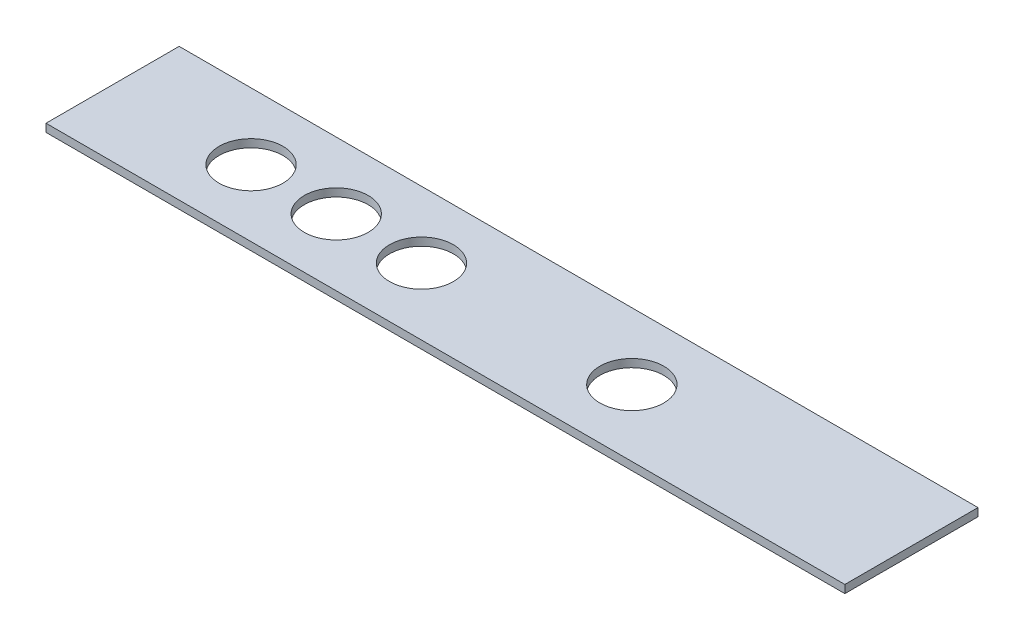
ISO-10303-21;
HEADER;
FILE_DESCRIPTION(('STEP AP214'),'2;1');
FILE_NAME('part.step','',(''),(''),'','','');
FILE_SCHEMA(('AUTOMOTIVE_DESIGN { 1 0 10303 214 1 1 1 1 }'));
ENDSEC;
DATA;
#1=APPLICATION_CONTEXT('core data for automotive mechanical design processes');
#2=APPLICATION_PROTOCOL_DEFINITION('international standard','automotive_design',2000,#1);
#3=PRODUCT_CONTEXT('',#1,'mechanical');
#4=PRODUCT('Part','Part','',(#3));
#5=PRODUCT_RELATED_PRODUCT_CATEGORY('part','',(#4));
#6=PRODUCT_DEFINITION_FORMATION('','',#4);
#7=PRODUCT_DEFINITION_CONTEXT('part definition',#1,'design');
#8=PRODUCT_DEFINITION('design','',#6,#7);
#9=PRODUCT_DEFINITION_SHAPE('','',#8);
#10=(LENGTH_UNIT() NAMED_UNIT(*) SI_UNIT(.MILLI.,.METRE.));
#11=(NAMED_UNIT(*) PLANE_ANGLE_UNIT() SI_UNIT($,.RADIAN.));
#12=(NAMED_UNIT(*) SI_UNIT($,.STERADIAN.) SOLID_ANGLE_UNIT());
#13=UNCERTAINTY_MEASURE_WITH_UNIT(LENGTH_MEASURE(1.E-05),#10,'distance_accuracy_value','');
#14=(GEOMETRIC_REPRESENTATION_CONTEXT(3) GLOBAL_UNCERTAINTY_ASSIGNED_CONTEXT((#13)) GLOBAL_UNIT_ASSIGNED_CONTEXT((#10,
#11,#12)) REPRESENTATION_CONTEXT('',''));
#15=CARTESIAN_POINT('',(0.,0.,0.));
#16=DIRECTION('',(0.,0.,1.));
#17=DIRECTION('',(1.,0.,0.));
#18=AXIS2_PLACEMENT_3D('',#15,#16,#17);
#19=CARTESIAN_POINT('',(0.,3.,0.));
#20=DIRECTION('',(0.,-1.,0.));
#21=DIRECTION('',(0.,0.,-1.));
#22=AXIS2_PLACEMENT_3D('',#19,#20,#21);
#23=PLANE('',#22);
#24=DIRECTION('',(1.,0.,0.));
#25=VECTOR('',#24,1.);
#26=CARTESIAN_POINT('',(-148.63813229572,3.,-3.11284046692607));
#27=LINE('',#26,#25);
#28=CARTESIAN_POINT('',(-148.63813229572,3.,-3.11284046692607));
#29=VERTEX_POINT('',#28);
#30=CARTESIAN_POINT('',(151.36186770428,3.,-3.11284046692607));
#31=VERTEX_POINT('',#30);
#32=EDGE_CURVE('E140',#29,#31,#27,.T.);
#33=ORIENTED_EDGE('',*,*,#32,.T.);
#34=DIRECTION('',(0.,0.,1.));
#35=VECTOR('',#34,1.);
#36=CARTESIAN_POINT('',(151.36186770428,3.,-53.1128404669261));
#37=LINE('',#36,#35);
#38=CARTESIAN_POINT('',(151.36186770428,3.,-53.1128404669261));
#39=VERTEX_POINT('',#38);
#40=EDGE_CURVE('E147',#39,#31,#37,.T.);
#41=ORIENTED_EDGE('',*,*,#40,.F.);
#42=DIRECTION('',(1.,0.,0.));
#43=VECTOR('',#42,1.);
#44=CARTESIAN_POINT('',(-148.63813229572,3.,-53.1128404669261));
#45=LINE('',#44,#43);
#46=CARTESIAN_POINT('',(-148.63813229572,3.,-53.1128404669261));
#47=VERTEX_POINT('',#46);
#48=EDGE_CURVE('E156',#47,#39,#45,.T.);
#49=ORIENTED_EDGE('',*,*,#48,.F.);
#50=DIRECTION('',(0.,0.,1.));
#51=VECTOR('',#50,1.);
#52=CARTESIAN_POINT('',(-148.63813229572,3.,-53.1128404669261));
#53=LINE('',#52,#51);
#54=EDGE_CURVE('E117',#47,#29,#53,.T.);
#55=ORIENTED_EDGE('',*,*,#54,.T.);
#56=EDGE_LOOP('',(#33,#41,#49,#55));
#57=FACE_BOUND('',#56,.T.);
#58=CARTESIAN_POINT('',(-32.6381322957198,3.,-28.1128404669261));
#59=DIRECTION('',(0.,1.,0.));
#60=DIRECTION('',(0.,0.,1.));
#61=AXIS2_PLACEMENT_3D('',#58,#59,#60);
#62=CIRCLE('',#61,12.);
#63=CARTESIAN_POINT('',(-32.6381322957198,3.,-16.1128404669261));
#64=VERTEX_POINT('',#63);
#65=EDGE_CURVE('E171',#64,#64,#62,.T.);
#66=ORIENTED_EDGE('',*,*,#65,.F.);
#67=EDGE_LOOP('',(#66));
#68=FACE_BOUND('',#67,.T.);
#69=CARTESIAN_POINT('',(46.3618677042802,3.,-28.1128404669261));
#70=DIRECTION('',(0.,1.,0.));
#71=DIRECTION('',(0.,0.,1.));
#72=AXIS2_PLACEMENT_3D('',#69,#70,#71);
#73=CIRCLE('',#72,12.);
#74=CARTESIAN_POINT('',(46.3618677042802,3.,-16.1128404669261));
#75=VERTEX_POINT('',#74);
#76=EDGE_CURVE('E213',#75,#75,#73,.T.);
#77=ORIENTED_EDGE('',*,*,#76,.F.);
#78=EDGE_LOOP('',(#77));
#79=FACE_BOUND('',#78,.T.);
#80=CARTESIAN_POINT('',(-64.6381322957199,3.,-28.1128404669261));
#81=DIRECTION('',(0.,1.,0.));
#82=DIRECTION('',(0.,0.,1.));
#83=AXIS2_PLACEMENT_3D('',#80,#81,#82);
#84=CIRCLE('',#83,12.);
#85=CARTESIAN_POINT('',(-64.6381322957199,3.,-16.1128404669261));
#86=VERTEX_POINT('',#85);
#87=EDGE_CURVE('E206',#86,#86,#84,.T.);
#88=ORIENTED_EDGE('',*,*,#87,.F.);
#89=EDGE_LOOP('',(#88));
#90=FACE_BOUND('',#89,.T.);
#91=CARTESIAN_POINT('',(-96.6381322957199,3.,-28.1128404669261));
#92=DIRECTION('',(0.,1.,0.));
#93=DIRECTION('',(0.,0.,1.));
#94=AXIS2_PLACEMENT_3D('',#91,#92,#93);
#95=CIRCLE('',#94,12.);
#96=CARTESIAN_POINT('',(-96.6381322957199,3.,-16.1128404669261));
#97=VERTEX_POINT('',#96);
#98=EDGE_CURVE('E199',#97,#97,#95,.T.);
#99=ORIENTED_EDGE('',*,*,#98,.F.);
#100=EDGE_LOOP('',(#99));
#101=FACE_BOUND('',#100,.T.);
#102=ADVANCED_FACE('F99',(#57,#68,#79,#90,#101),#23,.F.);
#103=CARTESIAN_POINT('',(0.,0.,0.));
#104=DIRECTION('',(0.,-1.,0.));
#105=DIRECTION('',(0.,0.,-1.));
#106=AXIS2_PLACEMENT_3D('',#103,#104,#105);
#107=PLANE('',#106);
#108=CARTESIAN_POINT('',(-64.6381322957199,0.,-28.1128404669261));
#109=DIRECTION('',(0.,1.,0.));
#110=DIRECTION('',(0.,0.,1.));
#111=AXIS2_PLACEMENT_3D('',#108,#109,#110);
#112=CIRCLE('',#111,12.);
#113=CARTESIAN_POINT('',(-64.6381322957199,0.,-16.1128404669261));
#114=VERTEX_POINT('',#113);
#115=EDGE_CURVE('E203',#114,#114,#112,.T.);
#116=ORIENTED_EDGE('',*,*,#115,.T.);
#117=EDGE_LOOP('',(#116));
#118=FACE_BOUND('',#117,.T.);
#119=CARTESIAN_POINT('',(-32.6381322957198,0.,-28.1128404669261));
#120=DIRECTION('',(0.,1.,0.));
#121=DIRECTION('',(0.,0.,1.));
#122=AXIS2_PLACEMENT_3D('',#119,#120,#121);
#123=CIRCLE('',#122,12.);
#124=CARTESIAN_POINT('',(-32.6381322957198,0.,-16.1128404669261));
#125=VERTEX_POINT('',#124);
#126=EDGE_CURVE('E217',#125,#125,#123,.T.);
#127=ORIENTED_EDGE('',*,*,#126,.T.);
#128=EDGE_LOOP('',(#127));
#129=FACE_BOUND('',#128,.T.);
#130=DIRECTION('',(1.,0.,0.));
#131=VECTOR('',#130,1.);
#132=CARTESIAN_POINT('',(-148.63813229572,0.,-3.11284046692607));
#133=LINE('',#132,#131);
#134=CARTESIAN_POINT('',(-148.63813229572,0.,-3.11284046692607));
#135=VERTEX_POINT('',#134);
#136=CARTESIAN_POINT('',(151.36186770428,0.,-3.11284046692607));
#137=VERTEX_POINT('',#136);
#138=EDGE_CURVE('E167',#135,#137,#133,.T.);
#139=ORIENTED_EDGE('',*,*,#138,.F.);
#140=DIRECTION('',(0.,0.,1.));
#141=VECTOR('',#140,1.);
#142=CARTESIAN_POINT('',(-148.63813229572,0.,-53.1128404669261));
#143=LINE('',#142,#141);
#144=CARTESIAN_POINT('',(-148.63813229572,0.,-53.1128404669261));
#145=VERTEX_POINT('',#144);
#146=EDGE_CURVE('E135',#145,#135,#143,.T.);
#147=ORIENTED_EDGE('',*,*,#146,.F.);
#148=DIRECTION('',(1.,0.,0.));
#149=VECTOR('',#148,1.);
#150=CARTESIAN_POINT('',(-148.63813229572,0.,-53.1128404669261));
#151=LINE('',#150,#149);
#152=CARTESIAN_POINT('',(151.36186770428,0.,-53.1128404669261));
#153=VERTEX_POINT('',#152);
#154=EDGE_CURVE('E174',#145,#153,#151,.T.);
#155=ORIENTED_EDGE('',*,*,#154,.T.);
#156=DIRECTION('',(0.,0.,1.));
#157=VECTOR('',#156,1.);
#158=CARTESIAN_POINT('',(151.36186770428,0.,-53.1128404669261));
#159=LINE('',#158,#157);
#160=EDGE_CURVE('E149',#153,#137,#159,.T.);
#161=ORIENTED_EDGE('',*,*,#160,.T.);
#162=EDGE_LOOP('',(#139,#147,#155,#161));
#163=FACE_BOUND('',#162,.T.);
#164=CARTESIAN_POINT('',(46.3618677042802,0.,-28.1128404669261));
#165=DIRECTION('',(0.,1.,0.));
#166=DIRECTION('',(0.,0.,1.));
#167=AXIS2_PLACEMENT_3D('',#164,#165,#166);
#168=CIRCLE('',#167,12.);
#169=CARTESIAN_POINT('',(46.3618677042802,0.,-16.1128404669261));
#170=VERTEX_POINT('',#169);
#171=EDGE_CURVE('E193',#170,#170,#168,.T.);
#172=ORIENTED_EDGE('',*,*,#171,.T.);
#173=EDGE_LOOP('',(#172));
#174=FACE_BOUND('',#173,.T.);
#175=CARTESIAN_POINT('',(-96.6381322957199,0.,-28.1128404669261));
#176=DIRECTION('',(0.,1.,0.));
#177=DIRECTION('',(0.,0.,1.));
#178=AXIS2_PLACEMENT_3D('',#175,#176,#177);
#179=CIRCLE('',#178,12.);
#180=CARTESIAN_POINT('',(-96.6381322957199,0.,-16.1128404669261));
#181=VERTEX_POINT('',#180);
#182=EDGE_CURVE('E196',#181,#181,#179,.T.);
#183=ORIENTED_EDGE('',*,*,#182,.T.);
#184=EDGE_LOOP('',(#183));
#185=FACE_BOUND('',#184,.T.);
#186=ADVANCED_FACE('F185',(#118,#129,#163,#174,#185),#107,.T.);
#187=CARTESIAN_POINT('',(-148.63813229572,3.,-3.11284046692607));
#188=DIRECTION('',(0.,0.,-1.));
#189=DIRECTION('',(-1.,0.,0.));
#190=AXIS2_PLACEMENT_3D('',#187,#188,#189);
#191=PLANE('',#190);
#192=ORIENTED_EDGE('',*,*,#138,.T.);
#193=DIRECTION('',(0.,-1.,0.));
#194=VECTOR('',#193,1.);
#195=CARTESIAN_POINT('',(151.36186770428,3.,-3.11284046692607));
#196=LINE('',#195,#194);
#197=EDGE_CURVE('E12',#31,#137,#196,.T.);
#198=ORIENTED_EDGE('',*,*,#197,.F.);
#199=ORIENTED_EDGE('',*,*,#32,.F.);
#200=DIRECTION('',(0.,-1.,0.));
#201=VECTOR('',#200,1.);
#202=CARTESIAN_POINT('',(-148.63813229572,3.,-3.11284046692607));
#203=LINE('',#202,#201);
#204=EDGE_CURVE('E163',#29,#135,#203,.T.);
#205=ORIENTED_EDGE('',*,*,#204,.T.);
#206=EDGE_LOOP('',(#192,#198,#199,#205));
#207=FACE_BOUND('',#206,.T.);
#208=ADVANCED_FACE('F101',(#207),#191,.F.);
#209=CARTESIAN_POINT('',(151.36186770428,3.,-53.1128404669261));
#210=DIRECTION('',(1.,0.,0.));
#211=DIRECTION('',(0.,0.,-1.));
#212=AXIS2_PLACEMENT_3D('',#209,#210,#211);
#213=PLANE('',#212);
#214=ORIENTED_EDGE('',*,*,#160,.F.);
#215=DIRECTION('',(0.,-1.,0.));
#216=VECTOR('',#215,1.);
#217=CARTESIAN_POINT('',(151.36186770428,3.,-53.1128404669261));
#218=LINE('',#217,#216);
#219=EDGE_CURVE('E109',#39,#153,#218,.T.);
#220=ORIENTED_EDGE('',*,*,#219,.F.);
#221=ORIENTED_EDGE('',*,*,#40,.T.);
#222=ORIENTED_EDGE('',*,*,#197,.T.);
#223=EDGE_LOOP('',(#214,#220,#221,#222));
#224=FACE_BOUND('',#223,.T.);
#225=ADVANCED_FACE('F146',(#224),#213,.T.);
#226=CARTESIAN_POINT('',(-148.63813229572,3.,-53.1128404669261));
#227=DIRECTION('',(0.,0.,-1.));
#228=DIRECTION('',(-1.,0.,0.));
#229=AXIS2_PLACEMENT_3D('',#226,#227,#228);
#230=PLANE('',#229);
#231=ORIENTED_EDGE('',*,*,#154,.F.);
#232=DIRECTION('',(0.,-1.,0.));
#233=VECTOR('',#232,1.);
#234=CARTESIAN_POINT('',(-148.63813229572,3.,-53.1128404669261));
#235=LINE('',#234,#233);
#236=EDGE_CURVE('E132',#47,#145,#235,.T.);
#237=ORIENTED_EDGE('',*,*,#236,.F.);
#238=ORIENTED_EDGE('',*,*,#48,.T.);
#239=ORIENTED_EDGE('',*,*,#219,.T.);
#240=EDGE_LOOP('',(#231,#237,#238,#239));
#241=FACE_BOUND('',#240,.T.);
#242=ADVANCED_FACE('F159',(#241),#230,.T.);
#243=CARTESIAN_POINT('',(-148.63813229572,3.,-53.1128404669261));
#244=DIRECTION('',(1.,0.,0.));
#245=DIRECTION('',(0.,0.,-1.));
#246=AXIS2_PLACEMENT_3D('',#243,#244,#245);
#247=PLANE('',#246);
#248=ORIENTED_EDGE('',*,*,#146,.T.);
#249=ORIENTED_EDGE('',*,*,#204,.F.);
#250=ORIENTED_EDGE('',*,*,#54,.F.);
#251=ORIENTED_EDGE('',*,*,#236,.T.);
#252=EDGE_LOOP('',(#248,#249,#250,#251));
#253=FACE_BOUND('',#252,.T.);
#254=ADVANCED_FACE('F232',(#253),#247,.F.);
#255=CARTESIAN_POINT('',(-32.6381322957198,3.,-28.1128404669261));
#256=DIRECTION('',(0.,-1.,0.));
#257=DIRECTION('',(0.,0.,-1.));
#258=AXIS2_PLACEMENT_3D('',#255,#256,#257);
#259=CYLINDRICAL_SURFACE('',#258,12.);
#260=ORIENTED_EDGE('',*,*,#65,.T.);
#261=EDGE_LOOP('',(#260));
#262=FACE_BOUND('',#261,.T.);
#263=ORIENTED_EDGE('',*,*,#126,.F.);
#264=EDGE_LOOP('',(#263));
#265=FACE_BOUND('',#264,.T.);
#266=ADVANCED_FACE('F229',(#262,#265),#259,.F.);
#267=CARTESIAN_POINT('',(46.3618677042802,3.,-28.1128404669261));
#268=DIRECTION('',(0.,-1.,0.));
#269=DIRECTION('',(0.,0.,-1.));
#270=AXIS2_PLACEMENT_3D('',#267,#268,#269);
#271=CYLINDRICAL_SURFACE('',#270,12.);
#272=ORIENTED_EDGE('',*,*,#76,.T.);
#273=EDGE_LOOP('',(#272));
#274=FACE_BOUND('',#273,.T.);
#275=ORIENTED_EDGE('',*,*,#171,.F.);
#276=EDGE_LOOP('',(#275));
#277=FACE_BOUND('',#276,.T.);
#278=ADVANCED_FACE('F231',(#274,#277),#271,.F.);
#279=CARTESIAN_POINT('',(-64.6381322957199,3.,-28.1128404669261));
#280=DIRECTION('',(0.,-1.,0.));
#281=DIRECTION('',(0.,0.,-1.));
#282=AXIS2_PLACEMENT_3D('',#279,#280,#281);
#283=CYLINDRICAL_SURFACE('',#282,12.);
#284=ORIENTED_EDGE('',*,*,#87,.T.);
#285=EDGE_LOOP('',(#284));
#286=FACE_BOUND('',#285,.T.);
#287=ORIENTED_EDGE('',*,*,#115,.F.);
#288=EDGE_LOOP('',(#287));
#289=FACE_BOUND('',#288,.T.);
#290=ADVANCED_FACE('F239',(#286,#289),#283,.F.);
#291=CARTESIAN_POINT('',(-96.6381322957199,3.,-28.1128404669261));
#292=DIRECTION('',(0.,-1.,0.));
#293=DIRECTION('',(0.,0.,-1.));
#294=AXIS2_PLACEMENT_3D('',#291,#292,#293);
#295=CYLINDRICAL_SURFACE('',#294,12.);
#296=ORIENTED_EDGE('',*,*,#98,.T.);
#297=EDGE_LOOP('',(#296));
#298=FACE_BOUND('',#297,.T.);
#299=ORIENTED_EDGE('',*,*,#182,.F.);
#300=EDGE_LOOP('',(#299));
#301=FACE_BOUND('',#300,.T.);
#302=ADVANCED_FACE('F298',(#298,#301),#295,.F.);
#303=CLOSED_SHELL('',(#102,#186,#208,#225,#242,#254,#266,#278,#290,#302));
#304=MANIFOLD_SOLID_BREP('B2',#303);
#305=ADVANCED_BREP_SHAPE_REPRESENTATION('',(#18,#304),#14);
#306=SHAPE_DEFINITION_REPRESENTATION(#9,#305);
ENDSEC;
END-ISO-10303-21;
